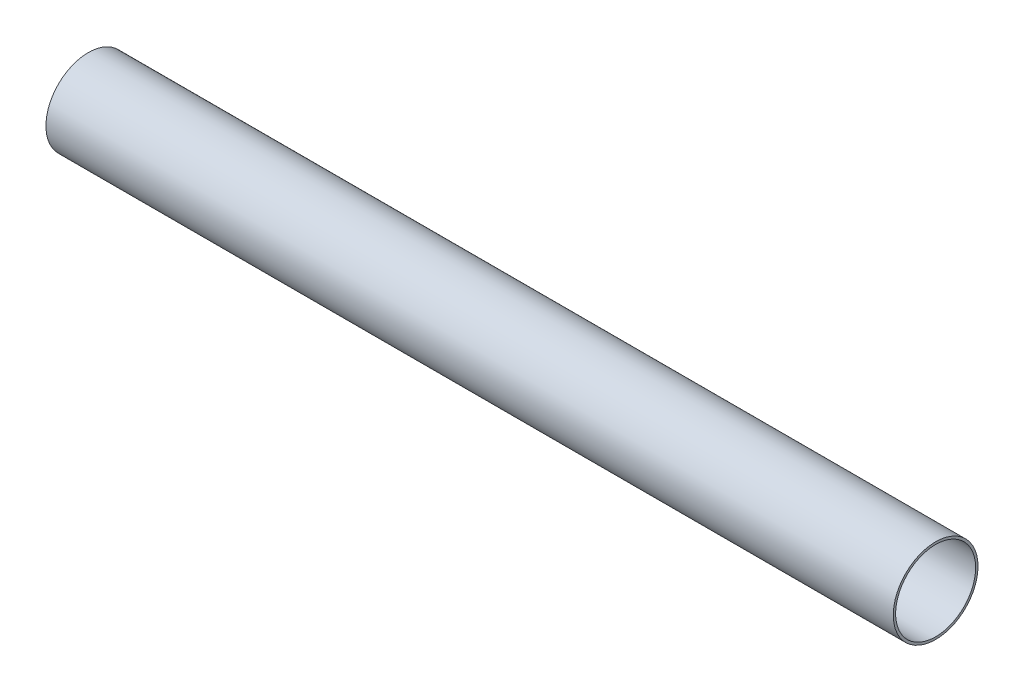
ISO-10303-21;
HEADER;
FILE_DESCRIPTION(('STEP AP214'),'2;1');
FILE_NAME('part.step','',(''),(''),'','','');
FILE_SCHEMA(('AUTOMOTIVE_DESIGN { 1 0 10303 214 1 1 1 1 }'));
ENDSEC;
DATA;
#1=APPLICATION_CONTEXT('core data for automotive mechanical design processes');
#2=APPLICATION_PROTOCOL_DEFINITION('international standard','automotive_design',2000,#1);
#3=PRODUCT_CONTEXT('',#1,'mechanical');
#4=PRODUCT('Part','Part','',(#3));
#5=PRODUCT_RELATED_PRODUCT_CATEGORY('part','',(#4));
#6=PRODUCT_DEFINITION_FORMATION('','',#4);
#7=PRODUCT_DEFINITION_CONTEXT('part definition',#1,'design');
#8=PRODUCT_DEFINITION('design','',#6,#7);
#9=PRODUCT_DEFINITION_SHAPE('','',#8);
#10=(LENGTH_UNIT() NAMED_UNIT(*) SI_UNIT(.MILLI.,.METRE.));
#11=(NAMED_UNIT(*) PLANE_ANGLE_UNIT() SI_UNIT($,.RADIAN.));
#12=(NAMED_UNIT(*) SI_UNIT($,.STERADIAN.) SOLID_ANGLE_UNIT());
#13=UNCERTAINTY_MEASURE_WITH_UNIT(LENGTH_MEASURE(1.E-05),#10,'distance_accuracy_value','');
#14=(GEOMETRIC_REPRESENTATION_CONTEXT(3) GLOBAL_UNCERTAINTY_ASSIGNED_CONTEXT((#13)) GLOBAL_UNIT_ASSIGNED_CONTEXT((#10,
#11,#12)) REPRESENTATION_CONTEXT('',''));
#15=CARTESIAN_POINT('',(0.,0.,0.));
#16=DIRECTION('',(0.,0.,1.));
#17=DIRECTION('',(1.,0.,0.));
#18=AXIS2_PLACEMENT_3D('',#15,#16,#17);
#19=CARTESIAN_POINT('',(127.,0.,0.));
#20=DIRECTION('',(1.,0.,0.));
#21=DIRECTION('',(0.,0.,-1.));
#22=AXIS2_PLACEMENT_3D('',#19,#20,#21);
#23=PLANE('',#22);
#24=CARTESIAN_POINT('',(127.,0.,0.));
#25=DIRECTION('',(1.,0.,0.));
#26=DIRECTION('',(0.,0.,-1.));
#27=AXIS2_PLACEMENT_3D('',#24,#25,#26);
#28=CIRCLE('',#27,12.7);
#29=CARTESIAN_POINT('',(127.,0.,-12.7));
#30=VERTEX_POINT('',#29);
#31=EDGE_CURVE('E10',#30,#30,#28,.T.);
#32=ORIENTED_EDGE('',*,*,#31,.T.);
#33=EDGE_LOOP('',(#32));
#34=FACE_BOUND('',#33,.T.);
#35=CARTESIAN_POINT('',(127.,0.,0.));
#36=DIRECTION('',(1.,0.,0.));
#37=DIRECTION('',(0.,0.,-1.));
#38=AXIS2_PLACEMENT_3D('',#35,#36,#37);
#39=CIRCLE('',#38,11.9888);
#40=CARTESIAN_POINT('',(127.,0.,-11.9888));
#41=VERTEX_POINT('',#40);
#42=EDGE_CURVE('E48',#41,#41,#39,.T.);
#43=ORIENTED_EDGE('',*,*,#42,.F.);
#44=EDGE_LOOP('',(#43));
#45=FACE_BOUND('',#44,.T.);
#46=ADVANCED_FACE('F37',(#34,#45),#23,.T.);
#47=CARTESIAN_POINT('',(-127.,0.,0.));
#48=DIRECTION('',(1.,0.,0.));
#49=DIRECTION('',(0.,0.,-1.));
#50=AXIS2_PLACEMENT_3D('',#47,#48,#49);
#51=PLANE('',#50);
#52=CARTESIAN_POINT('',(-127.,0.,0.));
#53=DIRECTION('',(1.,0.,0.));
#54=DIRECTION('',(0.,0.,-1.));
#55=AXIS2_PLACEMENT_3D('',#52,#53,#54);
#56=CIRCLE('',#55,12.7);
#57=CARTESIAN_POINT('',(-127.,0.,-12.7));
#58=VERTEX_POINT('',#57);
#59=EDGE_CURVE('E41',#58,#58,#56,.T.);
#60=ORIENTED_EDGE('',*,*,#59,.F.);
#61=EDGE_LOOP('',(#60));
#62=FACE_BOUND('',#61,.T.);
#63=CARTESIAN_POINT('',(-127.,0.,0.));
#64=DIRECTION('',(1.,0.,0.));
#65=DIRECTION('',(0.,0.,-1.));
#66=AXIS2_PLACEMENT_3D('',#63,#64,#65);
#67=CIRCLE('',#66,11.9888);
#68=CARTESIAN_POINT('',(-127.,0.,-11.9888));
#69=VERTEX_POINT('',#68);
#70=EDGE_CURVE('E50',#69,#69,#67,.T.);
#71=ORIENTED_EDGE('',*,*,#70,.T.);
#72=EDGE_LOOP('',(#71));
#73=FACE_BOUND('',#72,.T.);
#74=ADVANCED_FACE('F60',(#62,#73),#51,.F.);
#75=CARTESIAN_POINT('',(127.,0.,0.));
#76=DIRECTION('',(-1.,0.,0.));
#77=DIRECTION('',(0.,0.,1.));
#78=AXIS2_PLACEMENT_3D('',#75,#76,#77);
#79=CYLINDRICAL_SURFACE('',#78,12.7);
#80=ORIENTED_EDGE('',*,*,#31,.F.);
#81=EDGE_LOOP('',(#80));
#82=FACE_BOUND('',#81,.T.);
#83=ORIENTED_EDGE('',*,*,#59,.T.);
#84=EDGE_LOOP('',(#83));
#85=FACE_BOUND('',#84,.T.);
#86=ADVANCED_FACE('F39',(#82,#85),#79,.T.);
#87=CARTESIAN_POINT('',(127.,0.,0.));
#88=DIRECTION('',(-1.,0.,0.));
#89=DIRECTION('',(0.,0.,1.));
#90=AXIS2_PLACEMENT_3D('',#87,#88,#89);
#91=CYLINDRICAL_SURFACE('',#90,11.9888);
#92=ORIENTED_EDGE('',*,*,#42,.T.);
#93=EDGE_LOOP('',(#92));
#94=FACE_BOUND('',#93,.T.);
#95=ORIENTED_EDGE('',*,*,#70,.F.);
#96=EDGE_LOOP('',(#95));
#97=FACE_BOUND('',#96,.T.);
#98=ADVANCED_FACE('F56',(#94,#97),#91,.F.);
#99=CLOSED_SHELL('',(#46,#74,#86,#98));
#100=MANIFOLD_SOLID_BREP('B2',#99);
#101=ADVANCED_BREP_SHAPE_REPRESENTATION('',(#18,#100),#14);
#102=SHAPE_DEFINITION_REPRESENTATION(#9,#101);
ENDSEC;
END-ISO-10303-21;
